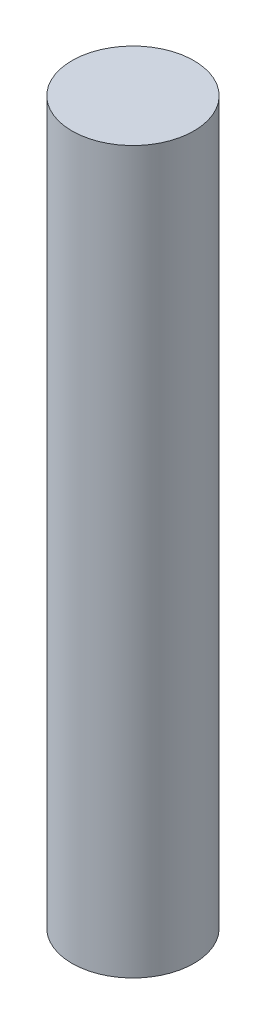
ISO-10303-21;
HEADER;
FILE_DESCRIPTION(('STEP AP214'),'2;1');
FILE_NAME('part.step','',(''),(''),'','','');
FILE_SCHEMA(('AUTOMOTIVE_DESIGN { 1 0 10303 214 1 1 1 1 }'));
ENDSEC;
DATA;
#1=APPLICATION_CONTEXT('core data for automotive mechanical design processes');
#2=APPLICATION_PROTOCOL_DEFINITION('international standard','automotive_design',2000,#1);
#3=PRODUCT_CONTEXT('',#1,'mechanical');
#4=PRODUCT('Part','Part','',(#3));
#5=PRODUCT_RELATED_PRODUCT_CATEGORY('part','',(#4));
#6=PRODUCT_DEFINITION_FORMATION('','',#4);
#7=PRODUCT_DEFINITION_CONTEXT('part definition',#1,'design');
#8=PRODUCT_DEFINITION('design','',#6,#7);
#9=PRODUCT_DEFINITION_SHAPE('','',#8);
#10=(LENGTH_UNIT() NAMED_UNIT(*) SI_UNIT(.MILLI.,.METRE.));
#11=(NAMED_UNIT(*) PLANE_ANGLE_UNIT() SI_UNIT($,.RADIAN.));
#12=(NAMED_UNIT(*) SI_UNIT($,.STERADIAN.) SOLID_ANGLE_UNIT());
#13=UNCERTAINTY_MEASURE_WITH_UNIT(LENGTH_MEASURE(1.E-05),#10,'distance_accuracy_value','');
#14=(GEOMETRIC_REPRESENTATION_CONTEXT(3) GLOBAL_UNCERTAINTY_ASSIGNED_CONTEXT((#13)) GLOBAL_UNIT_ASSIGNED_CONTEXT((#10,
#11,#12)) REPRESENTATION_CONTEXT('',''));
#15=CARTESIAN_POINT('',(0.,0.,0.));
#16=DIRECTION('',(0.,0.,1.));
#17=DIRECTION('',(1.,0.,0.));
#18=AXIS2_PLACEMENT_3D('',#15,#16,#17);
#19=CARTESIAN_POINT('',(0.,81.,0.));
#20=DIRECTION('',(0.,-1.,0.));
#21=DIRECTION('',(0.,0.,-1.));
#22=AXIS2_PLACEMENT_3D('',#19,#20,#21);
#23=CYLINDRICAL_SURFACE('',#22,6.85);
#24=CARTESIAN_POINT('',(0.,81.,0.));
#25=DIRECTION('',(0.,1.,0.));
#26=DIRECTION('',(0.,0.,1.));
#27=AXIS2_PLACEMENT_3D('',#24,#25,#26);
#28=CIRCLE('',#27,6.85);
#29=CARTESIAN_POINT('',(0.,81.,6.85));
#30=VERTEX_POINT('',#29);
#31=EDGE_CURVE('E10',#30,#30,#28,.T.);
#32=ORIENTED_EDGE('',*,*,#31,.F.);
#33=EDGE_LOOP('',(#32));
#34=FACE_BOUND('',#33,.T.);
#35=CARTESIAN_POINT('',(0.,0.,0.));
#36=DIRECTION('',(0.,1.,0.));
#37=DIRECTION('',(0.,0.,1.));
#38=AXIS2_PLACEMENT_3D('',#35,#36,#37);
#39=CIRCLE('',#38,6.85);
#40=CARTESIAN_POINT('',(0.,0.,6.85));
#41=VERTEX_POINT('',#40);
#42=EDGE_CURVE('E40',#41,#41,#39,.T.);
#43=ORIENTED_EDGE('',*,*,#42,.T.);
#44=EDGE_LOOP('',(#43));
#45=FACE_BOUND('',#44,.T.);
#46=ADVANCED_FACE('F37',(#34,#45),#23,.T.);
#47=CARTESIAN_POINT('',(0.,81.,0.));
#48=DIRECTION('',(0.,1.,0.));
#49=DIRECTION('',(0.,0.,1.));
#50=AXIS2_PLACEMENT_3D('',#47,#48,#49);
#51=PLANE('',#50);
#52=ORIENTED_EDGE('',*,*,#31,.T.);
#53=EDGE_LOOP('',(#52));
#54=FACE_BOUND('',#53,.T.);
#55=ADVANCED_FACE('F54',(#54),#51,.T.);
#56=CARTESIAN_POINT('',(0.,0.,0.));
#57=DIRECTION('',(0.,1.,0.));
#58=DIRECTION('',(0.,0.,1.));
#59=AXIS2_PLACEMENT_3D('',#56,#57,#58);
#60=PLANE('',#59);
#61=ORIENTED_EDGE('',*,*,#42,.F.);
#62=EDGE_LOOP('',(#61));
#63=FACE_BOUND('',#62,.T.);
#64=ADVANCED_FACE('F52',(#63),#60,.F.);
#65=CLOSED_SHELL('',(#46,#55,#64));
#66=MANIFOLD_SOLID_BREP('B2',#65);
#67=ADVANCED_BREP_SHAPE_REPRESENTATION('',(#18,#66),#14);
#68=SHAPE_DEFINITION_REPRESENTATION(#9,#67);
ENDSEC;
END-ISO-10303-21;
